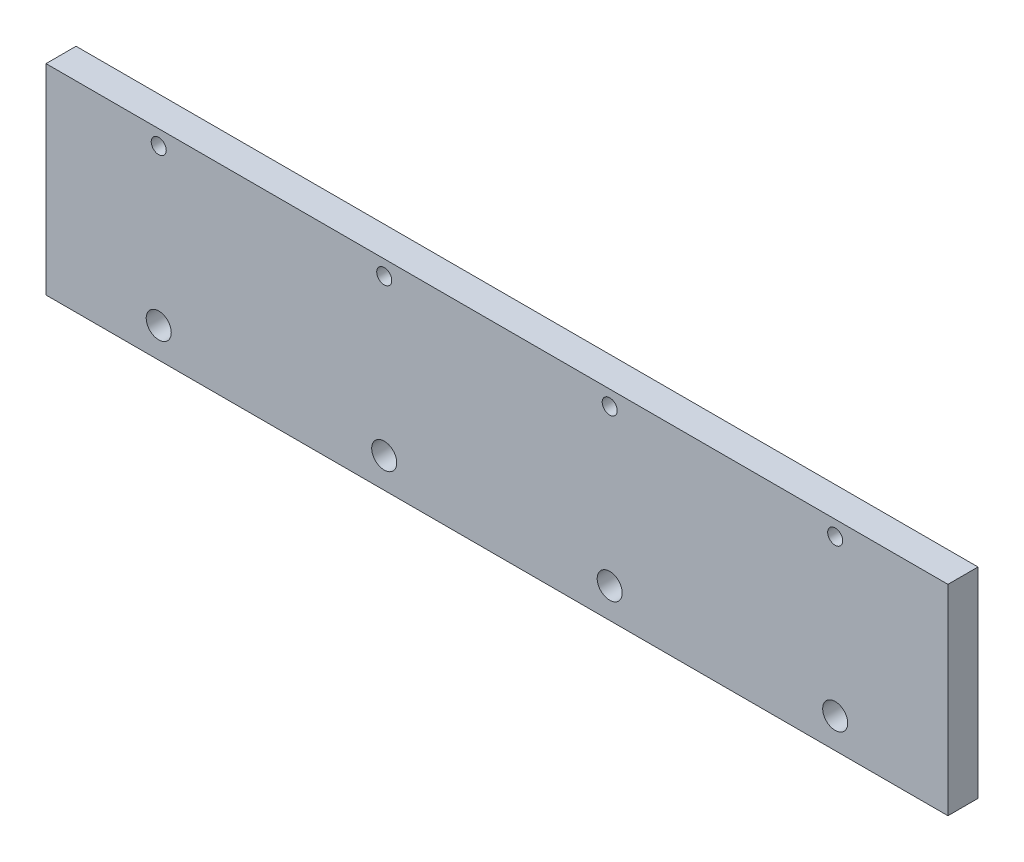
ISO-10303-21;
HEADER;
FILE_DESCRIPTION(('STEP AP214'),'2;1');
FILE_NAME('part.step','',(''),(''),'','','');
FILE_SCHEMA(('AUTOMOTIVE_DESIGN { 1 0 10303 214 1 1 1 1 }'));
ENDSEC;
DATA;
#1=APPLICATION_CONTEXT('core data for automotive mechanical design processes');
#2=APPLICATION_PROTOCOL_DEFINITION('international standard','automotive_design',2000,#1);
#3=PRODUCT_CONTEXT('',#1,'mechanical');
#4=PRODUCT('Part','Part','',(#3));
#5=PRODUCT_RELATED_PRODUCT_CATEGORY('part','',(#4));
#6=PRODUCT_DEFINITION_FORMATION('','',#4);
#7=PRODUCT_DEFINITION_CONTEXT('part definition',#1,'design');
#8=PRODUCT_DEFINITION('design','',#6,#7);
#9=PRODUCT_DEFINITION_SHAPE('','',#8);
#10=(LENGTH_UNIT() NAMED_UNIT(*) SI_UNIT(.MILLI.,.METRE.));
#11=(NAMED_UNIT(*) PLANE_ANGLE_UNIT() SI_UNIT($,.RADIAN.));
#12=(NAMED_UNIT(*) SI_UNIT($,.STERADIAN.) SOLID_ANGLE_UNIT());
#13=UNCERTAINTY_MEASURE_WITH_UNIT(LENGTH_MEASURE(1.E-05),#10,'distance_accuracy_value','');
#14=(GEOMETRIC_REPRESENTATION_CONTEXT(3) GLOBAL_UNCERTAINTY_ASSIGNED_CONTEXT((#13)) GLOBAL_UNIT_ASSIGNED_CONTEXT((#10,
#11,#12)) REPRESENTATION_CONTEXT('',''));
#15=CARTESIAN_POINT('',(0.,0.,0.));
#16=DIRECTION('',(0.,0.,1.));
#17=DIRECTION('',(1.,0.,0.));
#18=AXIS2_PLACEMENT_3D('',#15,#16,#17);
#19=CARTESIAN_POINT('',(180.,-40.,12.));
#20=DIRECTION('',(-1.,0.,0.));
#21=DIRECTION('',(0.,0.,1.));
#22=AXIS2_PLACEMENT_3D('',#19,#20,#21);
#23=PLANE('',#22);
#24=DIRECTION('',(0.,1.,0.));
#25=VECTOR('',#24,1.);
#26=CARTESIAN_POINT('',(180.,-40.,0.));
#27=LINE('',#26,#25);
#28=CARTESIAN_POINT('',(180.,-40.,0.));
#29=VERTEX_POINT('',#28);
#30=CARTESIAN_POINT('',(180.,40.,0.));
#31=VERTEX_POINT('',#30);
#32=EDGE_CURVE('E102',#29,#31,#27,.T.);
#33=ORIENTED_EDGE('',*,*,#32,.T.);
#34=DIRECTION('',(0.,0.,-1.));
#35=VECTOR('',#34,1.);
#36=CARTESIAN_POINT('',(180.,40.,12.));
#37=LINE('',#36,#35);
#38=CARTESIAN_POINT('',(180.,40.,12.));
#39=VERTEX_POINT('',#38);
#40=EDGE_CURVE('E93',#39,#31,#37,.T.);
#41=ORIENTED_EDGE('',*,*,#40,.F.);
#42=DIRECTION('',(0.,1.,0.));
#43=VECTOR('',#42,1.);
#44=CARTESIAN_POINT('',(180.,-40.,12.));
#45=LINE('',#44,#43);
#46=CARTESIAN_POINT('',(180.,-40.,12.));
#47=VERTEX_POINT('',#46);
#48=EDGE_CURVE('E87',#47,#39,#45,.T.);
#49=ORIENTED_EDGE('',*,*,#48,.F.);
#50=DIRECTION('',(0.,0.,-1.));
#51=VECTOR('',#50,1.);
#52=CARTESIAN_POINT('',(180.,-40.,12.));
#53=LINE('',#52,#51);
#54=EDGE_CURVE('E98',#47,#29,#53,.T.);
#55=ORIENTED_EDGE('',*,*,#54,.T.);
#56=EDGE_LOOP('',(#33,#41,#49,#55));
#57=FACE_BOUND('',#56,.T.);
#58=ADVANCED_FACE('F33',(#57),#23,.F.);
#59=CARTESIAN_POINT('',(-180.,40.,12.));
#60=DIRECTION('',(0.,-1.,0.));
#61=DIRECTION('',(0.,0.,-1.));
#62=AXIS2_PLACEMENT_3D('',#59,#60,#61);
#63=PLANE('',#62);
#64=DIRECTION('',(-1.,0.,0.));
#65=VECTOR('',#64,1.);
#66=CARTESIAN_POINT('',(-180.,40.,0.));
#67=LINE('',#66,#65);
#68=CARTESIAN_POINT('',(-180.,40.,0.));
#69=VERTEX_POINT('',#68);
#70=EDGE_CURVE('E92',#31,#69,#67,.T.);
#71=ORIENTED_EDGE('',*,*,#70,.T.);
#72=DIRECTION('',(0.,0.,-1.));
#73=VECTOR('',#72,1.);
#74=CARTESIAN_POINT('',(-180.,40.,12.));
#75=LINE('',#74,#73);
#76=CARTESIAN_POINT('',(-180.,40.,12.));
#77=VERTEX_POINT('',#76);
#78=EDGE_CURVE('E90',#77,#69,#75,.T.);
#79=ORIENTED_EDGE('',*,*,#78,.F.);
#80=DIRECTION('',(-1.,0.,0.));
#81=VECTOR('',#80,1.);
#82=CARTESIAN_POINT('',(-180.,40.,12.));
#83=LINE('',#82,#81);
#84=EDGE_CURVE('E81',#39,#77,#83,.T.);
#85=ORIENTED_EDGE('',*,*,#84,.F.);
#86=ORIENTED_EDGE('',*,*,#40,.T.);
#87=EDGE_LOOP('',(#71,#79,#85,#86));
#88=FACE_BOUND('',#87,.T.);
#89=ADVANCED_FACE('F91',(#88),#63,.F.);
#90=CARTESIAN_POINT('',(-180.,-40.,12.));
#91=DIRECTION('',(1.,0.,0.));
#92=DIRECTION('',(0.,0.,-1.));
#93=AXIS2_PLACEMENT_3D('',#90,#91,#92);
#94=PLANE('',#93);
#95=DIRECTION('',(0.,-1.,0.));
#96=VECTOR('',#95,1.);
#97=CARTESIAN_POINT('',(-180.,-40.,0.));
#98=LINE('',#97,#96);
#99=CARTESIAN_POINT('',(-180.,-40.,0.));
#100=VERTEX_POINT('',#99);
#101=EDGE_CURVE('E67',#69,#100,#98,.T.);
#102=ORIENTED_EDGE('',*,*,#101,.T.);
#103=DIRECTION('',(0.,0.,-1.));
#104=VECTOR('',#103,1.);
#105=CARTESIAN_POINT('',(-180.,-40.,12.));
#106=LINE('',#105,#104);
#107=CARTESIAN_POINT('',(-180.,-40.,12.));
#108=VERTEX_POINT('',#107);
#109=EDGE_CURVE('E94',#108,#100,#106,.T.);
#110=ORIENTED_EDGE('',*,*,#109,.F.);
#111=DIRECTION('',(0.,-1.,0.));
#112=VECTOR('',#111,1.);
#113=CARTESIAN_POINT('',(-180.,-40.,12.));
#114=LINE('',#113,#112);
#115=EDGE_CURVE('E85',#77,#108,#114,.T.);
#116=ORIENTED_EDGE('',*,*,#115,.F.);
#117=ORIENTED_EDGE('',*,*,#78,.T.);
#118=EDGE_LOOP('',(#102,#110,#116,#117));
#119=FACE_BOUND('',#118,.T.);
#120=ADVANCED_FACE('F96',(#119),#94,.F.);
#121=CARTESIAN_POINT('',(-180.,-40.,12.));
#122=DIRECTION('',(0.,1.,0.));
#123=DIRECTION('',(0.,0.,1.));
#124=AXIS2_PLACEMENT_3D('',#121,#122,#123);
#125=PLANE('',#124);
#126=DIRECTION('',(1.,0.,0.));
#127=VECTOR('',#126,1.);
#128=CARTESIAN_POINT('',(-180.,-40.,0.));
#129=LINE('',#128,#127);
#130=EDGE_CURVE('E73',#100,#29,#129,.T.);
#131=ORIENTED_EDGE('',*,*,#130,.T.);
#132=ORIENTED_EDGE('',*,*,#54,.F.);
#133=DIRECTION('',(1.,0.,0.));
#134=VECTOR('',#133,1.);
#135=CARTESIAN_POINT('',(-180.,-40.,12.));
#136=LINE('',#135,#134);
#137=EDGE_CURVE('E50',#108,#47,#136,.T.);
#138=ORIENTED_EDGE('',*,*,#137,.F.);
#139=ORIENTED_EDGE('',*,*,#109,.T.);
#140=EDGE_LOOP('',(#131,#132,#138,#139));
#141=FACE_BOUND('',#140,.T.);
#142=ADVANCED_FACE('F140',(#141),#125,.F.);
#143=CARTESIAN_POINT('',(180.,40.,12.));
#144=DIRECTION('',(0.,0.,-1.));
#145=DIRECTION('',(-1.,0.,0.));
#146=AXIS2_PLACEMENT_3D('',#143,#144,#145);
#147=PLANE('',#146);
#148=CARTESIAN_POINT('',(-45.,34.,12.));
#149=DIRECTION('',(0.,0.,1.));
#150=DIRECTION('',(1.,0.,0.));
#151=AXIS2_PLACEMENT_3D('',#148,#149,#150);
#152=CIRCLE('',#151,2.99999999999999);
#153=CARTESIAN_POINT('',(-42.,34.,12.));
#154=VERTEX_POINT('',#153);
#155=EDGE_CURVE('E223',#154,#154,#152,.T.);
#156=ORIENTED_EDGE('',*,*,#155,.F.);
#157=EDGE_LOOP('',(#156));
#158=FACE_BOUND('',#157,.T.);
#159=CARTESIAN_POINT('',(-45.,-28.,12.));
#160=DIRECTION('',(0.,0.,1.));
#161=DIRECTION('',(1.,0.,0.));
#162=AXIS2_PLACEMENT_3D('',#159,#160,#161);
#163=CIRCLE('',#162,4.99999999999999);
#164=CARTESIAN_POINT('',(-40.,-28.,12.));
#165=VERTEX_POINT('',#164);
#166=EDGE_CURVE('E215',#165,#165,#163,.T.);
#167=ORIENTED_EDGE('',*,*,#166,.F.);
#168=EDGE_LOOP('',(#167));
#169=FACE_BOUND('',#168,.T.);
#170=CARTESIAN_POINT('',(-135.,-28.,12.));
#171=DIRECTION('',(0.,0.,1.));
#172=DIRECTION('',(1.,0.,0.));
#173=AXIS2_PLACEMENT_3D('',#170,#171,#172);
#174=CIRCLE('',#173,4.99999999999999);
#175=CARTESIAN_POINT('',(-130.,-28.,12.));
#176=VERTEX_POINT('',#175);
#177=EDGE_CURVE('E209',#176,#176,#174,.T.);
#178=ORIENTED_EDGE('',*,*,#177,.F.);
#179=EDGE_LOOP('',(#178));
#180=FACE_BOUND('',#179,.T.);
#181=CARTESIAN_POINT('',(-135.,34.,12.));
#182=DIRECTION('',(0.,0.,1.));
#183=DIRECTION('',(1.,0.,0.));
#184=AXIS2_PLACEMENT_3D('',#181,#182,#183);
#185=CIRCLE('',#184,2.99999999999999);
#186=CARTESIAN_POINT('',(-132.,34.,12.));
#187=VERTEX_POINT('',#186);
#188=EDGE_CURVE('E105',#187,#187,#185,.T.);
#189=ORIENTED_EDGE('',*,*,#188,.F.);
#190=EDGE_LOOP('',(#189));
#191=FACE_BOUND('',#190,.T.);
#192=ORIENTED_EDGE('',*,*,#48,.T.);
#193=ORIENTED_EDGE('',*,*,#84,.T.);
#194=ORIENTED_EDGE('',*,*,#115,.T.);
#195=ORIENTED_EDGE('',*,*,#137,.T.);
#196=EDGE_LOOP('',(#192,#193,#194,#195));
#197=FACE_BOUND('',#196,.T.);
#198=CARTESIAN_POINT('',(45.,-28.,12.));
#199=DIRECTION('',(0.,0.,1.));
#200=DIRECTION('',(1.,0.,0.));
#201=AXIS2_PLACEMENT_3D('',#198,#199,#200);
#202=CIRCLE('',#201,4.99999999999999);
#203=CARTESIAN_POINT('',(50.,-28.,12.));
#204=VERTEX_POINT('',#203);
#205=EDGE_CURVE('E115',#204,#204,#202,.T.);
#206=ORIENTED_EDGE('',*,*,#205,.F.);
#207=EDGE_LOOP('',(#206));
#208=FACE_BOUND('',#207,.T.);
#209=CARTESIAN_POINT('',(135.,-28.,12.));
#210=DIRECTION('',(0.,0.,1.));
#211=DIRECTION('',(1.,0.,0.));
#212=AXIS2_PLACEMENT_3D('',#209,#210,#211);
#213=CIRCLE('',#212,4.99999999999999);
#214=CARTESIAN_POINT('',(140.,-28.,12.));
#215=VERTEX_POINT('',#214);
#216=EDGE_CURVE('E121',#215,#215,#213,.T.);
#217=ORIENTED_EDGE('',*,*,#216,.F.);
#218=EDGE_LOOP('',(#217));
#219=FACE_BOUND('',#218,.T.);
#220=CARTESIAN_POINT('',(45.,34.,12.));
#221=DIRECTION('',(0.,0.,1.));
#222=DIRECTION('',(1.,0.,0.));
#223=AXIS2_PLACEMENT_3D('',#220,#221,#222);
#224=CIRCLE('',#223,2.99999999999999);
#225=CARTESIAN_POINT('',(48.,34.,12.));
#226=VERTEX_POINT('',#225);
#227=EDGE_CURVE('E127',#226,#226,#224,.T.);
#228=ORIENTED_EDGE('',*,*,#227,.F.);
#229=EDGE_LOOP('',(#228));
#230=FACE_BOUND('',#229,.T.);
#231=CARTESIAN_POINT('',(135.,34.,12.));
#232=DIRECTION('',(0.,0.,1.));
#233=DIRECTION('',(1.,0.,0.));
#234=AXIS2_PLACEMENT_3D('',#231,#232,#233);
#235=CIRCLE('',#234,2.99999999999999);
#236=CARTESIAN_POINT('',(138.,34.,12.));
#237=VERTEX_POINT('',#236);
#238=EDGE_CURVE('E11',#237,#237,#235,.T.);
#239=ORIENTED_EDGE('',*,*,#238,.F.);
#240=EDGE_LOOP('',(#239));
#241=FACE_BOUND('',#240,.T.);
#242=ADVANCED_FACE('F82',(#158,#169,#180,#191,#197,#208,#219,#230,#241),#147,.F.);
#243=CARTESIAN_POINT('',(180.,40.,0.));
#244=DIRECTION('',(0.,0.,-1.));
#245=DIRECTION('',(-1.,0.,0.));
#246=AXIS2_PLACEMENT_3D('',#243,#244,#245);
#247=PLANE('',#246);
#248=CARTESIAN_POINT('',(-45.,34.,0.));
#249=DIRECTION('',(0.,0.,-1.));
#250=DIRECTION('',(-1.,0.,0.));
#251=AXIS2_PLACEMENT_3D('',#248,#249,#250);
#252=CIRCLE('',#251,2.99999999999999);
#253=CARTESIAN_POINT('',(-48.,34.,0.));
#254=VERTEX_POINT('',#253);
#255=EDGE_CURVE('E226',#254,#254,#252,.F.);
#256=ORIENTED_EDGE('',*,*,#255,.T.);
#257=EDGE_LOOP('',(#256));
#258=FACE_BOUND('',#257,.T.);
#259=CARTESIAN_POINT('',(-45.,-28.,0.));
#260=DIRECTION('',(0.,0.,-1.));
#261=DIRECTION('',(-1.,0.,0.));
#262=AXIS2_PLACEMENT_3D('',#259,#260,#261);
#263=CIRCLE('',#262,4.99999999999999);
#264=CARTESIAN_POINT('',(-50.,-28.,0.));
#265=VERTEX_POINT('',#264);
#266=EDGE_CURVE('E220',#265,#265,#263,.F.);
#267=ORIENTED_EDGE('',*,*,#266,.T.);
#268=EDGE_LOOP('',(#267));
#269=FACE_BOUND('',#268,.T.);
#270=CARTESIAN_POINT('',(-135.,-28.,0.));
#271=DIRECTION('',(0.,0.,-1.));
#272=DIRECTION('',(-1.,0.,0.));
#273=AXIS2_PLACEMENT_3D('',#270,#271,#272);
#274=CIRCLE('',#273,4.99999999999999);
#275=CARTESIAN_POINT('',(-140.,-28.,0.));
#276=VERTEX_POINT('',#275);
#277=EDGE_CURVE('E212',#276,#276,#274,.F.);
#278=ORIENTED_EDGE('',*,*,#277,.T.);
#279=EDGE_LOOP('',(#278));
#280=FACE_BOUND('',#279,.T.);
#281=CARTESIAN_POINT('',(-135.,34.,0.));
#282=DIRECTION('',(0.,0.,-1.));
#283=DIRECTION('',(-1.,0.,0.));
#284=AXIS2_PLACEMENT_3D('',#281,#282,#283);
#285=CIRCLE('',#284,2.99999999999999);
#286=CARTESIAN_POINT('',(-138.,34.,0.));
#287=VERTEX_POINT('',#286);
#288=EDGE_CURVE('E204',#287,#287,#285,.F.);
#289=ORIENTED_EDGE('',*,*,#288,.T.);
#290=EDGE_LOOP('',(#289));
#291=FACE_BOUND('',#290,.T.);
#292=ORIENTED_EDGE('',*,*,#32,.F.);
#293=ORIENTED_EDGE('',*,*,#130,.F.);
#294=ORIENTED_EDGE('',*,*,#101,.F.);
#295=ORIENTED_EDGE('',*,*,#70,.F.);
#296=EDGE_LOOP('',(#292,#293,#294,#295));
#297=FACE_BOUND('',#296,.T.);
#298=CARTESIAN_POINT('',(45.,-28.,0.));
#299=DIRECTION('',(0.,0.,-1.));
#300=DIRECTION('',(-1.,0.,0.));
#301=AXIS2_PLACEMENT_3D('',#298,#299,#300);
#302=CIRCLE('',#301,4.99999999999999);
#303=CARTESIAN_POINT('',(40.,-28.,0.));
#304=VERTEX_POINT('',#303);
#305=EDGE_CURVE('E112',#304,#304,#302,.F.);
#306=ORIENTED_EDGE('',*,*,#305,.T.);
#307=EDGE_LOOP('',(#306));
#308=FACE_BOUND('',#307,.T.);
#309=CARTESIAN_POINT('',(135.,-28.,0.));
#310=DIRECTION('',(0.,0.,-1.));
#311=DIRECTION('',(-1.,0.,0.));
#312=AXIS2_PLACEMENT_3D('',#309,#310,#311);
#313=CIRCLE('',#312,4.99999999999999);
#314=CARTESIAN_POINT('',(130.,-28.,0.));
#315=VERTEX_POINT('',#314);
#316=EDGE_CURVE('E118',#315,#315,#313,.F.);
#317=ORIENTED_EDGE('',*,*,#316,.T.);
#318=EDGE_LOOP('',(#317));
#319=FACE_BOUND('',#318,.T.);
#320=CARTESIAN_POINT('',(45.,34.,0.));
#321=DIRECTION('',(0.,0.,-1.));
#322=DIRECTION('',(-1.,0.,0.));
#323=AXIS2_PLACEMENT_3D('',#320,#321,#322);
#324=CIRCLE('',#323,2.99999999999999);
#325=CARTESIAN_POINT('',(42.,34.,0.));
#326=VERTEX_POINT('',#325);
#327=EDGE_CURVE('E124',#326,#326,#324,.F.);
#328=ORIENTED_EDGE('',*,*,#327,.T.);
#329=EDGE_LOOP('',(#328));
#330=FACE_BOUND('',#329,.T.);
#331=CARTESIAN_POINT('',(135.,34.,0.));
#332=DIRECTION('',(0.,0.,-1.));
#333=DIRECTION('',(-1.,0.,0.));
#334=AXIS2_PLACEMENT_3D('',#331,#332,#333);
#335=CIRCLE('',#334,2.99999999999999);
#336=CARTESIAN_POINT('',(132.,34.,0.));
#337=VERTEX_POINT('',#336);
#338=EDGE_CURVE('E42',#337,#337,#335,.F.);
#339=ORIENTED_EDGE('',*,*,#338,.T.);
#340=EDGE_LOOP('',(#339));
#341=FACE_BOUND('',#340,.T.);
#342=ADVANCED_FACE('F132',(#258,#269,#280,#291,#297,#308,#319,#330,#341),#247,.T.);
#343=CARTESIAN_POINT('',(-135.,34.,-0.000999999999999265));
#344=DIRECTION('',(0.,0.,1.));
#345=DIRECTION('',(1.,0.,0.));
#346=AXIS2_PLACEMENT_3D('',#343,#344,#345);
#347=CYLINDRICAL_SURFACE('',#346,2.99999999999999);
#348=ORIENTED_EDGE('',*,*,#288,.F.);
#349=EDGE_LOOP('',(#348));
#350=FACE_BOUND('',#349,.T.);
#351=ORIENTED_EDGE('',*,*,#188,.T.);
#352=EDGE_LOOP('',(#351));
#353=FACE_BOUND('',#352,.T.);
#354=ADVANCED_FACE('F147',(#350,#353),#347,.F.);
#355=CARTESIAN_POINT('',(-135.,-28.,-0.000999999999999265));
#356=DIRECTION('',(0.,0.,1.));
#357=DIRECTION('',(1.,0.,0.));
#358=AXIS2_PLACEMENT_3D('',#355,#356,#357);
#359=CYLINDRICAL_SURFACE('',#358,4.99999999999999);
#360=ORIENTED_EDGE('',*,*,#277,.F.);
#361=EDGE_LOOP('',(#360));
#362=FACE_BOUND('',#361,.T.);
#363=ORIENTED_EDGE('',*,*,#177,.T.);
#364=EDGE_LOOP('',(#363));
#365=FACE_BOUND('',#364,.T.);
#366=ADVANCED_FACE('F192',(#362,#365),#359,.F.);
#367=CARTESIAN_POINT('',(-45.,-28.,-0.000999999999999265));
#368=DIRECTION('',(0.,0.,1.));
#369=DIRECTION('',(1.,0.,0.));
#370=AXIS2_PLACEMENT_3D('',#367,#368,#369);
#371=CYLINDRICAL_SURFACE('',#370,4.99999999999999);
#372=ORIENTED_EDGE('',*,*,#266,.F.);
#373=EDGE_LOOP('',(#372));
#374=FACE_BOUND('',#373,.T.);
#375=ORIENTED_EDGE('',*,*,#166,.T.);
#376=EDGE_LOOP('',(#375));
#377=FACE_BOUND('',#376,.T.);
#378=ADVANCED_FACE('F168',(#374,#377),#371,.F.);
#379=CARTESIAN_POINT('',(45.,-28.,-0.000999999999999265));
#380=DIRECTION('',(0.,0.,1.));
#381=DIRECTION('',(1.,0.,0.));
#382=AXIS2_PLACEMENT_3D('',#379,#380,#381);
#383=CYLINDRICAL_SURFACE('',#382,4.99999999999999);
#384=ORIENTED_EDGE('',*,*,#305,.F.);
#385=EDGE_LOOP('',(#384));
#386=FACE_BOUND('',#385,.T.);
#387=ORIENTED_EDGE('',*,*,#205,.T.);
#388=EDGE_LOOP('',(#387));
#389=FACE_BOUND('',#388,.T.);
#390=ADVANCED_FACE('F164',(#386,#389),#383,.F.);
#391=CARTESIAN_POINT('',(135.,-28.,-0.000999999999999265));
#392=DIRECTION('',(0.,0.,1.));
#393=DIRECTION('',(1.,0.,0.));
#394=AXIS2_PLACEMENT_3D('',#391,#392,#393);
#395=CYLINDRICAL_SURFACE('',#394,4.99999999999999);
#396=ORIENTED_EDGE('',*,*,#316,.F.);
#397=EDGE_LOOP('',(#396));
#398=FACE_BOUND('',#397,.T.);
#399=ORIENTED_EDGE('',*,*,#216,.T.);
#400=EDGE_LOOP('',(#399));
#401=FACE_BOUND('',#400,.T.);
#402=ADVANCED_FACE('F167',(#398,#401),#395,.F.);
#403=CARTESIAN_POINT('',(-45.,34.,-0.000999999999999265));
#404=DIRECTION('',(0.,0.,1.));
#405=DIRECTION('',(1.,0.,0.));
#406=AXIS2_PLACEMENT_3D('',#403,#404,#405);
#407=CYLINDRICAL_SURFACE('',#406,2.99999999999999);
#408=ORIENTED_EDGE('',*,*,#255,.F.);
#409=EDGE_LOOP('',(#408));
#410=FACE_BOUND('',#409,.T.);
#411=ORIENTED_EDGE('',*,*,#155,.T.);
#412=EDGE_LOOP('',(#411));
#413=FACE_BOUND('',#412,.T.);
#414=ADVANCED_FACE('F171',(#410,#413),#407,.F.);
#415=CARTESIAN_POINT('',(45.,34.,-0.000999999999999265));
#416=DIRECTION('',(0.,0.,1.));
#417=DIRECTION('',(1.,0.,0.));
#418=AXIS2_PLACEMENT_3D('',#415,#416,#417);
#419=CYLINDRICAL_SURFACE('',#418,2.99999999999999);
#420=ORIENTED_EDGE('',*,*,#327,.F.);
#421=EDGE_LOOP('',(#420));
#422=FACE_BOUND('',#421,.T.);
#423=ORIENTED_EDGE('',*,*,#227,.T.);
#424=EDGE_LOOP('',(#423));
#425=FACE_BOUND('',#424,.T.);
#426=ADVANCED_FACE('F136',(#422,#425),#419,.F.);
#427=CARTESIAN_POINT('',(135.,34.,-0.000999999999999265));
#428=DIRECTION('',(0.,0.,1.));
#429=DIRECTION('',(1.,0.,0.));
#430=AXIS2_PLACEMENT_3D('',#427,#428,#429);
#431=CYLINDRICAL_SURFACE('',#430,2.99999999999999);
#432=ORIENTED_EDGE('',*,*,#338,.F.);
#433=EDGE_LOOP('',(#432));
#434=FACE_BOUND('',#433,.T.);
#435=ORIENTED_EDGE('',*,*,#238,.T.);
#436=EDGE_LOOP('',(#435));
#437=FACE_BOUND('',#436,.T.);
#438=ADVANCED_FACE('F35',(#434,#437),#431,.F.);
#439=CLOSED_SHELL('',(#58,#89,#120,#142,#242,#342,#354,#366,#378,#390,#402,#414,#426,#438));
#440=MANIFOLD_SOLID_BREP('B2',#439);
#441=ADVANCED_BREP_SHAPE_REPRESENTATION('',(#18,#440),#14);
#442=SHAPE_DEFINITION_REPRESENTATION(#9,#441);
ENDSEC;
END-ISO-10303-21;
